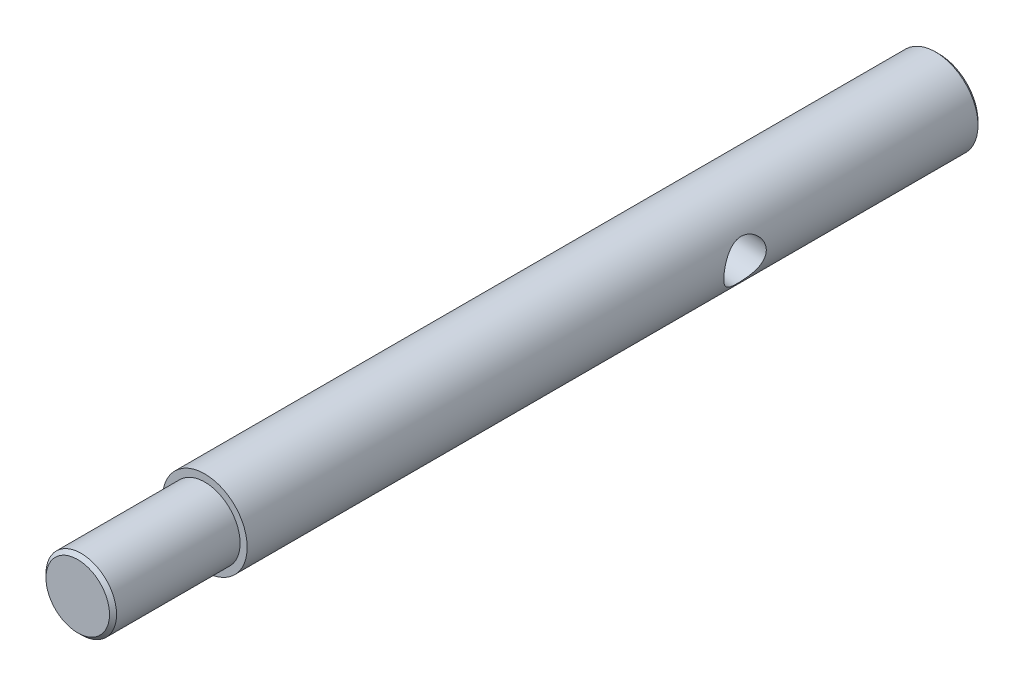
ISO-10303-21;
HEADER;
FILE_DESCRIPTION(('STEP AP214'),'2;1');
FILE_NAME('part.step','',(''),(''),'','','');
FILE_SCHEMA(('AUTOMOTIVE_DESIGN { 1 0 10303 214 1 1 1 1 }'));
ENDSEC;
DATA;
#1=APPLICATION_CONTEXT('core data for automotive mechanical design processes');
#2=APPLICATION_PROTOCOL_DEFINITION('international standard','automotive_design',2000,#1);
#3=PRODUCT_CONTEXT('',#1,'mechanical');
#4=PRODUCT('Part','Part','',(#3));
#5=PRODUCT_RELATED_PRODUCT_CATEGORY('part','',(#4));
#6=PRODUCT_DEFINITION_FORMATION('','',#4);
#7=PRODUCT_DEFINITION_CONTEXT('part definition',#1,'design');
#8=PRODUCT_DEFINITION('design','',#6,#7);
#9=PRODUCT_DEFINITION_SHAPE('','',#8);
#10=(LENGTH_UNIT() NAMED_UNIT(*) SI_UNIT(.MILLI.,.METRE.));
#11=(NAMED_UNIT(*) PLANE_ANGLE_UNIT() SI_UNIT($,.RADIAN.));
#12=(NAMED_UNIT(*) SI_UNIT($,.STERADIAN.) SOLID_ANGLE_UNIT());
#13=UNCERTAINTY_MEASURE_WITH_UNIT(LENGTH_MEASURE(1.E-05),#10,'distance_accuracy_value','');
#14=(GEOMETRIC_REPRESENTATION_CONTEXT(3) GLOBAL_UNCERTAINTY_ASSIGNED_CONTEXT((#13)) GLOBAL_UNIT_ASSIGNED_CONTEXT((#10,
#11,#12)) REPRESENTATION_CONTEXT('',''));
#15=CARTESIAN_POINT('',(0.,0.,0.));
#16=DIRECTION('',(0.,0.,1.));
#17=DIRECTION('',(1.,0.,0.));
#18=AXIS2_PLACEMENT_3D('',#15,#16,#17);
#19=CARTESIAN_POINT('',(0.,0.,52.));
#20=DIRECTION('',(0.,0.,-1.));
#21=DIRECTION('',(-1.,0.,0.));
#22=AXIS2_PLACEMENT_3D('',#19,#20,#21);
#23=CYLINDRICAL_SURFACE('',#22,3.);
#24=CARTESIAN_POINT('',(-3.,0.,18.2143135417994));
#25=CARTESIAN_POINT('',(-2.99999604519581,-0.0812307022564733,18.2013360100943));
#26=CARTESIAN_POINT('',(-2.99666542715368,-0.161513732822318,18.1817102737043));
#27=CARTESIAN_POINT('',(-2.98417294621646,-0.31762355307647,18.1300707130773));
#28=CARTESIAN_POINT('',(-2.97499609259359,-0.393438337832063,18.0980251252319));
#29=CARTESIAN_POINT('',(-2.95223296609462,-0.538203126753,18.0229738196702));
#30=CARTESIAN_POINT('',(-2.93866853018779,-0.607184962286992,17.9800226022618));
#31=CARTESIAN_POINT('',(-2.9087659513031,-0.73725171863679,17.8843301745882));
#32=CARTESIAN_POINT('',(-2.89242812454773,-0.798337538360486,17.8315900803885));
#33=CARTESIAN_POINT('',(-2.85759066854851,-0.915518234738467,17.7133278695293));
#34=CARTESIAN_POINT('',(-2.83901999921921,-0.970943522987882,17.6471612871005));
#35=CARTESIAN_POINT('',(-2.80319648697224,-1.06998595782667,17.5061296596799));
#36=CARTESIAN_POINT('',(-2.78594407320058,-1.11359927079342,17.4312618018952));
#37=CARTESIAN_POINT('',(-2.75517384141262,-1.18770742468053,17.2737449849632));
#38=CARTESIAN_POINT('',(-2.74168722963967,-1.21809375040491,17.1910381990197));
#39=CARTESIAN_POINT('',(-2.72105986534038,-1.26351744239799,17.0207962971352));
#40=CARTESIAN_POINT('',(-2.71390965443481,-1.27857769098598,16.9332685855767));
#41=CARTESIAN_POINT('',(-2.70777609283501,-1.29150529884435,16.7673787366593));
#42=CARTESIAN_POINT('',(-2.70790828032525,-1.29123451706386,16.6891908486848));
#43=CARTESIAN_POINT('',(-2.71413492850899,-1.27809369113548,16.5341265737795));
#44=CARTESIAN_POINT('',(-2.72022965230115,-1.2652230910169,16.4572502448739));
#45=CARTESIAN_POINT('',(-2.73695687704413,-1.22859276764372,16.3110136337334));
#46=CARTESIAN_POINT('',(-2.7473366935347,-1.20543464814015,16.2414704130545));
#47=CARTESIAN_POINT('',(-2.77125356513842,-1.14938202304038,16.1070217369428));
#48=CARTESIAN_POINT('',(-2.78479163265922,-1.11648439443941,16.0421177774037));
#49=CARTESIAN_POINT('',(-2.81503853643696,-1.03802677649181,15.9115267502122));
#50=CARTESIAN_POINT('',(-2.83193070030643,-0.991505797750976,15.8464600758641));
#51=CARTESIAN_POINT('',(-2.86578370536543,-0.888933128264163,15.7243132360598));
#52=CARTESIAN_POINT('',(-2.88274458416671,-0.83287524021601,15.6672383080706));
#53=CARTESIAN_POINT('',(-2.91647559470672,-0.706307279210518,15.5568842572839));
#54=CARTESIAN_POINT('',(-2.93305727239127,-0.634912774454884,15.5045544901688));
#55=CARTESIAN_POINT('',(-2.9617611261274,-0.48362021751671,15.4124241804987));
#56=CARTESIAN_POINT('',(-2.97388452356697,-0.403724502066339,15.372620206816));
#57=CARTESIAN_POINT('',(-2.99141274617212,-0.24066532530349,15.3083586364044));
#58=CARTESIAN_POINT('',(-2.99704746402606,-0.15772885295217,15.2833921854091));
#59=CARTESIAN_POINT('',(-3.00116618916275,0.0113286924226541,15.2478529303894));
#60=CARTESIAN_POINT('',(-2.9996560942048,0.0974470806516754,15.2372682640605));
#61=CARTESIAN_POINT('',(-2.98962275195827,0.261174281998638,15.231373047615));
#62=CARTESIAN_POINT('',(-2.98181036589243,0.338779437380847,15.2346509314516));
#63=CARTESIAN_POINT('',(-2.96043353327546,0.491724893353882,15.2531754105189));
#64=CARTESIAN_POINT('',(-2.94686936681936,0.567065304039918,15.2684214229671));
#65=CARTESIAN_POINT('',(-2.91522053360371,0.711959286235553,15.3097786549755));
#66=CARTESIAN_POINT('',(-2.89723194785451,0.781598592550341,15.335665915986));
#67=CARTESIAN_POINT('',(-2.85781982535887,0.915274735306419,15.3973468786261));
#68=CARTESIAN_POINT('',(-2.83639544214081,0.979310185110243,15.4331430230727));
#69=CARTESIAN_POINT('',(-2.78974539634004,1.10553170939836,15.51684548273));
#70=CARTESIAN_POINT('',(-2.76435298946208,1.16716754951018,15.565487508697));
#71=CARTESIAN_POINT('',(-2.71314300550318,1.28171742867725,15.67199978072));
#72=CARTESIAN_POINT('',(-2.68732512472545,1.33462491214794,15.7298768993523));
#73=CARTESIAN_POINT('',(-2.63515512360277,1.43507299906523,15.8592211442467));
#74=CARTESIAN_POINT('',(-2.60895437058395,1.48173729391503,15.9314346602565));
#75=CARTESIAN_POINT('',(-2.56138105595984,1.56254120669627,16.0840319301325));
#76=CARTESIAN_POINT('',(-2.540006863956,1.59668505643725,16.1644129117083));
#77=CARTESIAN_POINT('',(-2.50555564401644,1.65020568327475,16.3284315114877));
#78=CARTESIAN_POINT('',(-2.49221323732095,1.67005959545908,16.411855160542));
#79=CARTESIAN_POINT('',(-2.47474063324896,1.69585323835118,16.5817277348871));
#80=CARTESIAN_POINT('',(-2.47059880799227,1.701810532363,16.6681727011926));
#81=CARTESIAN_POINT('',(-2.47208649202625,1.69964003689189,16.8298708196398));
#82=CARTESIAN_POINT('',(-2.47655308410798,1.69318876321822,16.905164785232));
#83=CARTESIAN_POINT('',(-2.49242630523018,1.66973315481268,17.0533358875676));
#84=CARTESIAN_POINT('',(-2.50383482493135,1.65272594510571,17.1262123601936));
#85=CARTESIAN_POINT('',(-2.53218613093449,1.60894433757293,17.2673695104071));
#86=CARTESIAN_POINT('',(-2.54910074349222,1.58221958298469,17.3356714936391));
#87=CARTESIAN_POINT('',(-2.58682478868084,1.51975864492983,17.4668519981941));
#88=CARTESIAN_POINT('',(-2.60763573719338,1.48401895228784,17.5297283947197));
#89=CARTESIAN_POINT('',(-2.65414651111875,1.39932592643511,17.6564614199799));
#90=CARTESIAN_POINT('',(-2.68013286402947,1.34928889081845,17.7194902024427));
#91=CARTESIAN_POINT('',(-2.73258315490022,1.23963082610468,17.8363908815294));
#92=CARTESIAN_POINT('',(-2.75904733680172,1.18000477133217,17.8902579458001));
#93=CARTESIAN_POINT('',(-2.81205743549215,1.04773238627867,17.9909382326086));
#94=CARTESIAN_POINT('',(-2.83848509645514,0.974474388939389,18.0370168207204));
#95=CARTESIAN_POINT('',(-2.88698906714404,0.819667637338575,18.1156456823411));
#96=CARTESIAN_POINT('',(-2.90906640855994,0.738120855755066,18.1481991654));
#97=CARTESIAN_POINT('',(-2.94551569464369,0.574853644068528,18.1965123312431));
#98=CARTESIAN_POINT('',(-2.96030888391216,0.493520571740529,18.2132617912272));
#99=CARTESIAN_POINT('',(-2.98313075670827,0.328382961322562,18.2327428060764));
#100=CARTESIAN_POINT('',(-2.99117657064352,0.244585244463099,18.2355099500108));
#101=CARTESIAN_POINT('',(-2.99712313276631,0.134134640392853,18.22988237694));
#102=CARTESIAN_POINT('',(-2.99820440163332,0.107206058701201,18.2277765608667));
#103=CARTESIAN_POINT('',(-2.9996434317869,0.0534842253873582,18.22212412959));
#104=CARTESIAN_POINT('',(-3.00000129947785,0.0266909544408392,18.2185777263734));
#105=CARTESIAN_POINT('',(-3.,0.,18.2143135417994));
#106=B_SPLINE_CURVE_WITH_KNOTS('',3,(#24,#25,#26,#27,#28,#29,#30,#31,#32,#33,#34,#35,#36,#37,
#38,#39,#40,#41,#42,#43,#44,#45,#46,#47,#48,#49,#50,#51,#52,#53,#54,#55,#56,#57,#58,#59,#60,#61,
#62,#63,#64,#65,#66,#67,#68,#69,#70,#71,#72,#73,#74,#75,#76,#77,#78,#79,#80,#81,#82,#83,#84,#85,
#86,#87,#88,#89,#90,#91,#92,#93,#94,#95,#96,#97,#98,#99,#100,#101,#102,#103,#104,#105),
.UNSPECIFIED.,.T.,.F.,(4,2,2,2,2,2,2,2,2,2,2,2,2,2,2,2,2,2,2,2,2,2,2,2,2,2,2,2,2,2,2,2,2,2,2,2,
2,2,2,2,4),(0.,0.24666997617246,0.493975015373786,0.740067683930315,0.986132311783514,
1.24979862621398,1.51355041230527,1.77942702703615,2.04490609455818,2.27822267621186,
2.51154955349265,2.73273260957636,2.95398666567302,3.19824827827415,3.44266922822405,
3.71151661640626,3.9802902963396,4.23921612084678,4.49792824967307,4.73096565600551,
4.96399171539444,5.19234596347072,5.4207565574714,5.66729708760361,5.91402195150478,
6.18236278878242,6.45061284523964,6.70942831601306,6.96791650403532,7.19390966746847,
7.41996440857585,7.6448801840832,7.8698836462958,8.12251835492783,8.37528590538752,
8.64534505835704,8.91534008878677,9.16701199022433,9.41804298950358,9.49910625178215,
9.58015758967597),.UNSPECIFIED.);
#107=CARTESIAN_POINT('',(-3.,0.,18.2143135417994));
#108=VERTEX_POINT('',#107);
#109=EDGE_CURVE('E34',#108,#108,#106,.T.);
#110=ORIENTED_EDGE('',*,*,#109,.T.);
#111=EDGE_LOOP('',(#110));
#112=FACE_BOUND('',#111,.T.);
#113=CARTESIAN_POINT('',(2.70857922401349,1.28980563932806,16.7332005306815));
#114=CARTESIAN_POINT('',(2.70858558075898,1.28979966242757,16.6550388183886));
#115=CARTESIAN_POINT('',(2.71166237403614,1.28339163895094,16.5767784133939));
#116=CARTESIAN_POINT('',(2.7234784334481,1.25811270893873,16.4226596336658));
#117=CARTESIAN_POINT('',(2.73222959746395,1.23921561401841,16.3468066581164));
#118=CARTESIAN_POINT('',(2.75399538612149,1.19005084464699,16.2000230341656));
#119=CARTESIAN_POINT('',(2.76698729950648,1.15984361737685,16.1290685519711));
#120=CARTESIAN_POINT('',(2.79554850763854,1.08919960425749,15.9930642276864));
#121=CARTESIAN_POINT('',(2.81111794180264,1.04876226500333,15.9280147052878));
#122=CARTESIAN_POINT('',(2.84440118370475,0.955013728129275,15.7997419378453));
#123=CARTESIAN_POINT('',(2.86218594215311,0.900915800561801,15.7371118271712));
#124=CARTESIAN_POINT('',(2.89660399210582,0.78322745189845,15.6210879480715));
#125=CARTESIAN_POINT('',(2.91323670678368,0.719632325149283,15.5676987868062));
#126=CARTESIAN_POINT('',(2.94439521202348,0.579663285941741,15.46814980396));
#127=CARTESIAN_POINT('',(2.95870340585359,0.502716950151749,15.4227198788922));
#128=CARTESIAN_POINT('',(2.98161145045232,0.341474634002845,15.3454892508129));
#129=CARTESIAN_POINT('',(2.99021490561175,0.257183332537678,15.3136799464758));
#130=CARTESIAN_POINT('',(2.99973018085523,0.0900858266581162,15.2669435387299));
#131=CARTESIAN_POINT('',(3.00114573585509,0.0076007137281708,15.2509762411482));
#132=CARTESIAN_POINT('',(2.99695175220369,-0.158685266499064,15.232951352669));
#133=CARTESIAN_POINT('',(2.99134646663164,-0.2424853068849,15.230885345488));
#134=CARTESIAN_POINT('',(2.974026288757,-0.401236599669553,15.240320541637));
#135=CARTESIAN_POINT('',(2.962885080413,-0.476323639114197,15.2506575539634));
#136=CARTESIAN_POINT('',(2.9355256599041,-0.623108368398715,15.2825217965385));
#137=CARTESIAN_POINT('',(2.91930706786562,-0.694805804177187,15.3040498641459));
#138=CARTESIAN_POINT('',(2.88263327117305,-0.834079226640548,15.3578243798162));
#139=CARTESIAN_POINT('',(2.86212255569477,-0.901584467019578,15.3902150004396));
#140=CARTESIAN_POINT('',(2.8184175401905,-1.03011536063574,15.4645956549838));
#141=CARTESIAN_POINT('',(2.79522228087384,-1.09113868260323,15.506589125635));
#142=CARTESIAN_POINT('',(2.74546668917179,-1.21120794704051,15.603543557981));
#143=CARTESIAN_POINT('',(2.71879552477365,-1.26952170346032,15.6593550731705));
#144=CARTESIAN_POINT('',(2.66630515394672,-1.37636013404556,15.7800851180768));
#145=CARTESIAN_POINT('',(2.64048661557657,-1.42487727766733,15.8450105890926));
#146=CARTESIAN_POINT('',(2.59053632191094,-1.51389954084048,15.9871728193176));
#147=CARTESIAN_POINT('',(2.56661580327764,-1.55370020899269,16.0649295652628));
#148=CARTESIAN_POINT('',(2.52542538339551,-1.61980203937555,16.22760703772));
#149=CARTESIAN_POINT('',(2.50814854688488,-1.64611728847781,16.3125201802079));
#150=CARTESIAN_POINT('',(2.48387360584791,-1.68250358533141,16.4800222976057));
#151=CARTESIAN_POINT('',(2.47616945307774,-1.69369665861212,16.5622622092468));
#152=CARTESIAN_POINT('',(2.46981076226558,-1.70296047717062,16.7278025429563));
#153=CARTESIAN_POINT('',(2.47114983172459,-1.70104049183424,16.8111021743612));
#154=CARTESIAN_POINT('',(2.48200411934901,-1.68514775063601,16.9666814085496));
#155=CARTESIAN_POINT('',(2.49060891661327,-1.6725164346742,17.0391697073434));
#156=CARTESIAN_POINT('',(2.51376751583624,-1.63750116713265,17.1807522100879));
#157=CARTESIAN_POINT('',(2.52832324426729,-1.61511405719198,17.2498453068014));
#158=CARTESIAN_POINT('',(2.56267943470573,-1.56005417863508,17.3863175270356));
#159=CARTESIAN_POINT('',(2.58269158420302,-1.52695305008091,17.4534690559618));
#160=CARTESIAN_POINT('',(2.62574875031675,-1.45166227938401,17.58140443799));
#161=CARTESIAN_POINT('',(2.64879532260539,-1.40946796828153,17.6421849959514));
#162=CARTESIAN_POINT('',(2.69909446921955,-1.31084755630745,17.7636686819668));
#163=CARTESIAN_POINT('',(2.72651102445337,-1.2532979294449,17.823396256758));
#164=CARTESIAN_POINT('',(2.78046072734967,-1.12856313443333,17.9323188876719));
#165=CARTESIAN_POINT('',(2.80699357406001,-1.06137472425826,17.9815103860273));
#166=CARTESIAN_POINT('',(2.8575669657072,-0.916694389146538,18.0690611196067));
#167=CARTESIAN_POINT('',(2.88152325326465,-0.838977334106497,18.1071002079979));
#168=CARTESIAN_POINT('',(2.92388949330593,-0.676668694547436,18.1689073864676));
#169=CARTESIAN_POINT('',(2.94230430885138,-0.592083220866535,18.192688007731));
#170=CARTESIAN_POINT('',(2.97056428633974,-0.426763482979755,18.2232533769435));
#171=CARTESIAN_POINT('',(2.98104071130674,-0.346387948428087,18.2313973444957));
#172=CARTESIAN_POINT('',(2.99539864922264,-0.184811238471162,18.2344654288631));
#173=CARTESIAN_POINT('',(2.99928247002387,-0.103610362008901,18.2293941734668));
#174=CARTESIAN_POINT('',(3.00049467089259,0.0516444982037058,18.2070759204881));
#175=CARTESIAN_POINT('',(2.99823815439172,0.125816841861852,18.190653256795));
#176=CARTESIAN_POINT('',(2.98865005380452,0.270629350963042,18.1472100317271));
#177=CARTESIAN_POINT('',(2.98131774180349,0.341269008228941,18.1201879505413));
#178=CARTESIAN_POINT('',(2.96216230331918,0.480347612942845,18.0551099524325));
#179=CARTESIAN_POINT('',(2.95016051606227,0.548563213753469,18.0166315458697));
#180=CARTESIAN_POINT('',(2.92311285770351,0.678082572395976,17.9302636343929));
#181=CARTESIAN_POINT('',(2.90806558837493,0.739383135224081,17.882369807008));
#182=CARTESIAN_POINT('',(2.87493184474032,0.859671399259187,17.7730048221475));
#183=CARTESIAN_POINT('',(2.85669194036833,0.917821786649109,17.7106567994657));
#184=CARTESIAN_POINT('',(2.82070505421525,1.02309639270604,17.5770244489869));
#185=CARTESIAN_POINT('',(2.80295852069647,1.07021085556708,17.50573229938));
#186=CARTESIAN_POINT('',(2.76988237647876,1.15317543114158,17.3532455608101));
#187=CARTESIAN_POINT('',(2.75464686824941,1.18862251668528,17.2718092339884));
#188=CARTESIAN_POINT('',(2.72996227222547,1.24428981272492,17.1032019241718));
#189=CARTESIAN_POINT('',(2.72049385226532,1.26456094829191,17.0160511973125));
#190=CARTESIAN_POINT('',(2.71275855394669,1.28099799313419,16.8954924972035));
#191=CARTESIAN_POINT('',(2.71119732172147,1.28429545522022,16.8631486890847));
#192=CARTESIAN_POINT('',(2.70910629879374,1.28870059594066,16.7982758096581));
#193=CARTESIAN_POINT('',(2.70857657709245,1.2898081280833,16.7657467261027));
#194=CARTESIAN_POINT('',(2.70857922401349,1.28980563932806,16.7332005306815));
#195=B_SPLINE_CURVE_WITH_KNOTS('',3,(#113,#114,#115,#116,#117,#118,#119,#120,#121,#122,#123,
#124,#125,#126,#127,#128,#129,#130,#131,#132,#133,#134,#135,#136,#137,#138,#139,#140,#141,#142,
#143,#144,#145,#146,#147,#148,#149,#150,#151,#152,#153,#154,#155,#156,#157,#158,#159,#160,#161,
#162,#163,#164,#165,#166,#167,#168,#169,#170,#171,#172,#173,#174,#175,#176,#177,#178,#179,#180,
#181,#182,#183,#184,#185,#186,#187,#188,#189,#190,#191,#192,#193,#194),.UNSPECIFIED.,.T.,.F.,(4,
2,2,2,2,2,2,2,2,2,2,2,2,2,2,2,2,2,2,2,2,2,2,2,2,2,2,2,2,2,2,2,2,2,2,2,2,2,2,2,4),(0.,
0.234348183892075,0.469189339237204,0.702792893878324,0.936409088167719,1.18929346874734,
1.44230356626555,1.71236838358144,1.98226240445835,2.23295227451901,2.48349035529058,
2.71224146226806,2.94100968776181,3.17294302096718,3.40495949025406,3.65890787185334,
3.91305072368876,4.1833326259417,4.45333161317555,4.70193436281315,4.95036139782557,
5.17161275136035,5.39293578654092,5.62450944609128,5.85620229330068,6.11710115370917,
6.378087974673,6.64596272119445,6.91360169713154,7.15668405584227,7.39968130190954,
7.62666637307235,7.85368400268015,8.09041126079204,8.32724745151074,8.58765362775097,
8.84828914267727,9.11716123557903,9.38512699504136,9.4827020277796,9.58028358741806),.UNSPECIFIED.);
#196=CARTESIAN_POINT('',(2.70857922401349,1.28980563932806,16.7332005306815));
#197=VERTEX_POINT('',#196);
#198=EDGE_CURVE('E10',#197,#197,#195,.T.);
#199=ORIENTED_EDGE('',*,*,#198,.T.);
#200=EDGE_LOOP('',(#199));
#201=FACE_BOUND('',#200,.T.);
#202=CARTESIAN_POINT('',(0.,0.,0.250000000000049));
#203=DIRECTION('',(0.,0.,1.));
#204=DIRECTION('',(1.,0.,0.));
#205=AXIS2_PLACEMENT_3D('',#202,#203,#204);
#206=CIRCLE('',#205,3.);
#207=CARTESIAN_POINT('',(3.,0.,0.250000000000049));
#208=VERTEX_POINT('',#207);
#209=EDGE_CURVE('E47',#208,#208,#206,.T.);
#210=ORIENTED_EDGE('',*,*,#209,.T.);
#211=EDGE_LOOP('',(#210));
#212=FACE_BOUND('',#211,.T.);
#213=CARTESIAN_POINT('',(0.,0.,52.));
#214=DIRECTION('',(0.,0.,1.));
#215=DIRECTION('',(1.,0.,0.));
#216=AXIS2_PLACEMENT_3D('',#213,#214,#215);
#217=CIRCLE('',#216,3.);
#218=CARTESIAN_POINT('',(3.,0.,52.));
#219=VERTEX_POINT('',#218);
#220=EDGE_CURVE('E90',#219,#219,#217,.T.);
#221=ORIENTED_EDGE('',*,*,#220,.F.);
#222=EDGE_LOOP('',(#221));
#223=FACE_BOUND('',#222,.T.);
#224=ADVANCED_FACE('F30',(#112,#201,#212,#223),#23,.T.);
#225=CARTESIAN_POINT('',(0.,0.,52.));
#226=DIRECTION('',(0.,0.,1.));
#227=DIRECTION('',(1.,0.,0.));
#228=AXIS2_PLACEMENT_3D('',#225,#226,#227);
#229=PLANE('',#228);
#230=CARTESIAN_POINT('',(0.,0.,52.));
#231=DIRECTION('',(0.,0.,1.));
#232=DIRECTION('',(1.,0.,0.));
#233=AXIS2_PLACEMENT_3D('',#230,#231,#232);
#234=CIRCLE('',#233,2.5);
#235=CARTESIAN_POINT('',(2.5,0.,52.));
#236=VERTEX_POINT('',#235);
#237=EDGE_CURVE('E92',#236,#236,#234,.T.);
#238=ORIENTED_EDGE('',*,*,#237,.F.);
#239=EDGE_LOOP('',(#238));
#240=FACE_BOUND('',#239,.T.);
#241=ORIENTED_EDGE('',*,*,#220,.T.);
#242=EDGE_LOOP('',(#241));
#243=FACE_BOUND('',#242,.T.);
#244=ADVANCED_FACE('F71',(#240,#243),#229,.T.);
#245=CARTESIAN_POINT('',(0.,0.,0.));
#246=DIRECTION('',(0.,0.,1.));
#247=DIRECTION('',(1.,0.,0.));
#248=AXIS2_PLACEMENT_3D('',#245,#246,#247);
#249=PLANE('',#248);
#250=CARTESIAN_POINT('',(0.,0.,0.));
#251=DIRECTION('',(0.,0.,1.));
#252=DIRECTION('',(1.,0.,0.));
#253=AXIS2_PLACEMENT_3D('',#250,#251,#252);
#254=CIRCLE('',#253,2.74999999999995);
#255=CARTESIAN_POINT('',(2.74999999999995,0.,0.));
#256=VERTEX_POINT('',#255);
#257=EDGE_CURVE('E43',#256,#256,#254,.F.);
#258=ORIENTED_EDGE('',*,*,#257,.T.);
#259=EDGE_LOOP('',(#258));
#260=FACE_BOUND('',#259,.T.);
#261=ADVANCED_FACE('F69',(#260),#249,.F.);
#262=CARTESIAN_POINT('',(0.,0.,61.));
#263=DIRECTION('',(0.,0.,-1.));
#264=DIRECTION('',(-1.,0.,0.));
#265=AXIS2_PLACEMENT_3D('',#262,#263,#264);
#266=CYLINDRICAL_SURFACE('',#265,2.5);
#267=CARTESIAN_POINT('',(0.,0.,60.75));
#268=DIRECTION('',(0.,0.,1.));
#269=DIRECTION('',(1.,0.,0.));
#270=AXIS2_PLACEMENT_3D('',#267,#268,#269);
#271=CIRCLE('',#270,2.5);
#272=CARTESIAN_POINT('',(2.5,0.,60.75));
#273=VERTEX_POINT('',#272);
#274=EDGE_CURVE('E100',#273,#273,#271,.F.);
#275=ORIENTED_EDGE('',*,*,#274,.T.);
#276=EDGE_LOOP('',(#275));
#277=FACE_BOUND('',#276,.T.);
#278=ORIENTED_EDGE('',*,*,#237,.T.);
#279=EDGE_LOOP('',(#278));
#280=FACE_BOUND('',#279,.T.);
#281=ADVANCED_FACE('F65',(#277,#280),#266,.T.);
#282=CARTESIAN_POINT('',(0.,0.,61.));
#283=DIRECTION('',(0.,0.,1.));
#284=DIRECTION('',(1.,0.,0.));
#285=AXIS2_PLACEMENT_3D('',#282,#283,#284);
#286=PLANE('',#285);
#287=CARTESIAN_POINT('',(0.,0.,61.));
#288=DIRECTION('',(0.,0.,1.));
#289=DIRECTION('',(1.,0.,0.));
#290=AXIS2_PLACEMENT_3D('',#287,#288,#289);
#291=CIRCLE('',#290,2.25);
#292=CARTESIAN_POINT('',(2.25,0.,61.));
#293=VERTEX_POINT('',#292);
#294=EDGE_CURVE('E95',#293,#293,#291,.T.);
#295=ORIENTED_EDGE('',*,*,#294,.T.);
#296=EDGE_LOOP('',(#295));
#297=FACE_BOUND('',#296,.T.);
#298=ADVANCED_FACE('F60',(#297),#286,.T.);
#299=CARTESIAN_POINT('',(0.,0.,61.));
#300=DIRECTION('',(0.,0.,-1.));
#301=DIRECTION('',(-1.,0.,0.));
#302=AXIS2_PLACEMENT_3D('',#299,#300,#301);
#303=CONICAL_SURFACE('',#302,2.25,0.78539816339743);
#304=ORIENTED_EDGE('',*,*,#274,.F.);
#305=EDGE_LOOP('',(#304));
#306=FACE_BOUND('',#305,.T.);
#307=ORIENTED_EDGE('',*,*,#294,.F.);
#308=EDGE_LOOP('',(#307));
#309=FACE_BOUND('',#308,.T.);
#310=ADVANCED_FACE('F64',(#306,#309),#303,.T.);
#311=CARTESIAN_POINT('',(0.,0.,0.250000000000049));
#312=DIRECTION('',(0.,0.,1.));
#313=DIRECTION('',(1.,0.,0.));
#314=AXIS2_PLACEMENT_3D('',#311,#312,#313);
#315=CONICAL_SURFACE('',#314,3.,0.785398163397445);
#316=ORIENTED_EDGE('',*,*,#257,.F.);
#317=EDGE_LOOP('',(#316));
#318=FACE_BOUND('',#317,.T.);
#319=ORIENTED_EDGE('',*,*,#209,.F.);
#320=EDGE_LOOP('',(#319));
#321=FACE_BOUND('',#320,.T.);
#322=ADVANCED_FACE('F32',(#318,#321),#315,.T.);
#323=CARTESIAN_POINT('',(2.99060123582246,-0.237285162404213,16.7332005306815));
#324=DIRECTION('',(0.996867078607486,-0.0790950541347374,0.));
#325=DIRECTION('',(0.0790950541347374,0.996867078607486,0.));
#326=AXIS2_PLACEMENT_3D('',#323,#324,#325);
#327=CYLINDRICAL_SURFACE('',#326,1.49999999999999);
#328=ORIENTED_EDGE('',*,*,#198,.F.);
#329=EDGE_LOOP('',(#328));
#330=FACE_BOUND('',#329,.T.);
#331=ORIENTED_EDGE('',*,*,#109,.F.);
#332=EDGE_LOOP('',(#331));
#333=FACE_BOUND('',#332,.T.);
#334=ADVANCED_FACE('F55',(#330,#333),#327,.F.);
#335=CLOSED_SHELL('',(#224,#244,#261,#281,#298,#310,#322,#334));
#336=MANIFOLD_SOLID_BREP('B2',#335);
#337=ADVANCED_BREP_SHAPE_REPRESENTATION('',(#18,#336),#14);
#338=SHAPE_DEFINITION_REPRESENTATION(#9,#337);
ENDSEC;
END-ISO-10303-21;
